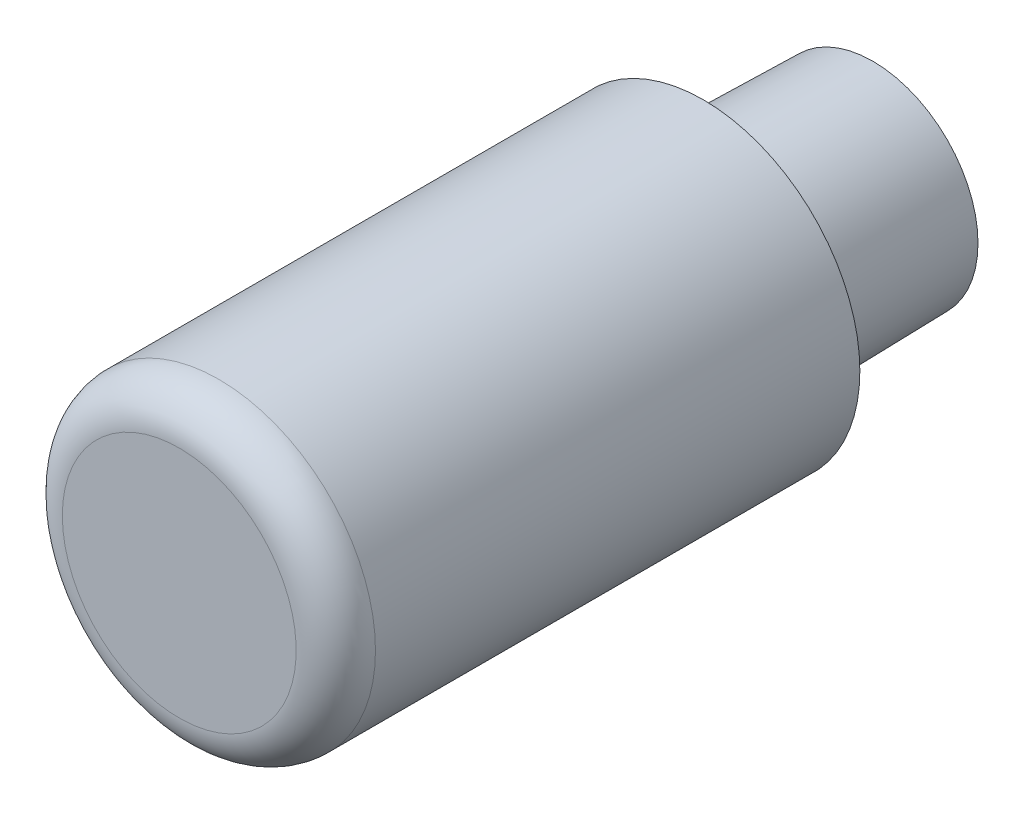
ISO-10303-21;
HEADER;
FILE_DESCRIPTION(('STEP AP214'),'2;1');
FILE_NAME('part.step','',(''),(''),'','','');
FILE_SCHEMA(('AUTOMOTIVE_DESIGN { 1 0 10303 214 1 1 1 1 }'));
ENDSEC;
DATA;
#1=APPLICATION_CONTEXT('core data for automotive mechanical design processes');
#2=APPLICATION_PROTOCOL_DEFINITION('international standard','automotive_design',2000,#1);
#3=PRODUCT_CONTEXT('',#1,'mechanical');
#4=PRODUCT('Part','Part','',(#3));
#5=PRODUCT_RELATED_PRODUCT_CATEGORY('part','',(#4));
#6=PRODUCT_DEFINITION_FORMATION('','',#4);
#7=PRODUCT_DEFINITION_CONTEXT('part definition',#1,'design');
#8=PRODUCT_DEFINITION('design','',#6,#7);
#9=PRODUCT_DEFINITION_SHAPE('','',#8);
#10=(LENGTH_UNIT() NAMED_UNIT(*) SI_UNIT(.MILLI.,.METRE.));
#11=(NAMED_UNIT(*) PLANE_ANGLE_UNIT() SI_UNIT($,.RADIAN.));
#12=(NAMED_UNIT(*) SI_UNIT($,.STERADIAN.) SOLID_ANGLE_UNIT());
#13=UNCERTAINTY_MEASURE_WITH_UNIT(LENGTH_MEASURE(1.E-05),#10,'distance_accuracy_value','');
#14=(GEOMETRIC_REPRESENTATION_CONTEXT(3) GLOBAL_UNCERTAINTY_ASSIGNED_CONTEXT((#13)) GLOBAL_UNIT_ASSIGNED_CONTEXT((#10,
#11,#12)) REPRESENTATION_CONTEXT('',''));
#15=CARTESIAN_POINT('',(0.,0.,0.));
#16=DIRECTION('',(0.,0.,1.));
#17=DIRECTION('',(1.,0.,0.));
#18=AXIS2_PLACEMENT_3D('',#15,#16,#17);
#19=CARTESIAN_POINT('',(0.,0.,38.6588));
#20=DIRECTION('',(0.,0.,-1.));
#21=DIRECTION('',(-1.,0.,0.));
#22=AXIS2_PLACEMENT_3D('',#19,#20,#21);
#23=PLANE('',#22);
#24=CARTESIAN_POINT('',(0.,0.,38.6588));
#25=DIRECTION('',(0.,0.,-1.));
#26=DIRECTION('',(-1.,0.,0.));
#27=AXIS2_PLACEMENT_3D('',#24,#25,#26);
#28=CIRCLE('',#27,7.493);
#29=CARTESIAN_POINT('',(-7.493,0.,38.6588));
#30=VERTEX_POINT('',#29);
#31=EDGE_CURVE('E42',#30,#30,#28,.F.);
#32=ORIENTED_EDGE('',*,*,#31,.T.);
#33=EDGE_LOOP('',(#32));
#34=FACE_BOUND('',#33,.T.);
#35=ADVANCED_FACE('F35',(#34),#23,.F.);
#36=CARTESIAN_POINT('',(0.,0.,26.8029829819766));
#37=DIRECTION('',(0.,0.,1.));
#38=DIRECTION('',(1.,0.,0.));
#39=AXIS2_PLACEMENT_3D('',#36,#37,#38);
#40=CYLINDRICAL_SURFACE('',#39,10.033);
#41=CARTESIAN_POINT('',(0.,0.,36.1188));
#42=DIRECTION('',(0.,0.,-1.));
#43=DIRECTION('',(-1.,0.,0.));
#44=AXIS2_PLACEMENT_3D('',#41,#42,#43);
#45=CIRCLE('',#44,10.033);
#46=CARTESIAN_POINT('',(-10.033,0.,36.1188));
#47=VERTEX_POINT('',#46);
#48=EDGE_CURVE('E10',#47,#47,#45,.T.);
#49=ORIENTED_EDGE('',*,*,#48,.T.);
#50=EDGE_LOOP('',(#49));
#51=FACE_BOUND('',#50,.T.);
#52=CARTESIAN_POINT('',(0.,0.,5.08));
#53=DIRECTION('',(0.,0.,1.));
#54=DIRECTION('',(1.,0.,0.));
#55=AXIS2_PLACEMENT_3D('',#52,#53,#54);
#56=CIRCLE('',#55,10.033);
#57=CARTESIAN_POINT('',(10.033,0.,5.08));
#58=VERTEX_POINT('',#57);
#59=EDGE_CURVE('E46',#58,#58,#56,.T.);
#60=ORIENTED_EDGE('',*,*,#59,.T.);
#61=EDGE_LOOP('',(#60));
#62=FACE_BOUND('',#61,.T.);
#63=ADVANCED_FACE('F73',(#51,#62),#40,.T.);
#64=CARTESIAN_POINT('',(0.,10.033,5.08));
#65=DIRECTION('',(0.,0.,1.));
#66=DIRECTION('',(1.,0.,0.));
#67=AXIS2_PLACEMENT_3D('',#64,#65,#66);
#68=PLANE('',#67);
#69=ORIENTED_EDGE('',*,*,#59,.F.);
#70=EDGE_LOOP('',(#69));
#71=FACE_BOUND('',#70,.T.);
#72=CARTESIAN_POINT('',(0.,0.,5.08));
#73=DIRECTION('',(0.,0.,1.));
#74=DIRECTION('',(1.,0.,0.));
#75=AXIS2_PLACEMENT_3D('',#72,#73,#74);
#76=CIRCLE('',#75,6.9596);
#77=CARTESIAN_POINT('',(6.9596,0.,5.08));
#78=VERTEX_POINT('',#77);
#79=EDGE_CURVE('E50',#78,#78,#76,.T.);
#80=ORIENTED_EDGE('',*,*,#79,.T.);
#81=EDGE_LOOP('',(#80));
#82=FACE_BOUND('',#81,.T.);
#83=ADVANCED_FACE('F69',(#71,#82),#68,.F.);
#84=CARTESIAN_POINT('',(0.,0.,-5.7912));
#85=DIRECTION('',(0.,0.,1.));
#86=DIRECTION('',(1.,0.,0.));
#87=AXIS2_PLACEMENT_3D('',#84,#85,#86);
#88=CONICAL_SURFACE('',#87,6.73188082238531,0.020943951023932);
#89=ORIENTED_EDGE('',*,*,#79,.F.);
#90=EDGE_LOOP('',(#89));
#91=FACE_BOUND('',#90,.T.);
#92=CARTESIAN_POINT('',(0.,0.,-5.7912));
#93=DIRECTION('',(0.,0.,1.));
#94=DIRECTION('',(1.,0.,0.));
#95=AXIS2_PLACEMENT_3D('',#92,#93,#94);
#96=CIRCLE('',#95,6.73188082238531);
#97=CARTESIAN_POINT('',(6.73188082238531,0.,-5.7912));
#98=VERTEX_POINT('',#97);
#99=EDGE_CURVE('E55',#98,#98,#96,.T.);
#100=ORIENTED_EDGE('',*,*,#99,.T.);
#101=EDGE_LOOP('',(#100));
#102=FACE_BOUND('',#101,.T.);
#103=ADVANCED_FACE('F59',(#91,#102),#88,.T.);
#104=CARTESIAN_POINT('',(0.,6.73188082238531,-5.7912));
#105=DIRECTION('',(0.,0.,1.));
#106=DIRECTION('',(1.,0.,0.));
#107=AXIS2_PLACEMENT_3D('',#104,#105,#106);
#108=PLANE('',#107);
#109=ORIENTED_EDGE('',*,*,#99,.F.);
#110=EDGE_LOOP('',(#109));
#111=FACE_BOUND('',#110,.T.);
#112=ADVANCED_FACE('F61',(#111),#108,.F.);
#113=CARTESIAN_POINT('',(0.,0.,36.1188));
#114=DIRECTION('',(0.,0.,-1.));
#115=DIRECTION('',(-1.,0.,0.));
#116=AXIS2_PLACEMENT_3D('',#113,#114,#115);
#117=TOROIDAL_SURFACE('',#116,7.493,2.54);
#118=ORIENTED_EDGE('',*,*,#48,.F.);
#119=EDGE_LOOP('',(#118));
#120=FACE_BOUND('',#119,.T.);
#121=ORIENTED_EDGE('',*,*,#31,.F.);
#122=EDGE_LOOP('',(#121));
#123=FACE_BOUND('',#122,.T.);
#124=ADVANCED_FACE('F37',(#120,#123),#117,.T.);
#125=CLOSED_SHELL('',(#35,#63,#83,#103,#112,#124));
#126=MANIFOLD_SOLID_BREP('B2',#125);
#127=ADVANCED_BREP_SHAPE_REPRESENTATION('',(#18,#126),#14);
#128=SHAPE_DEFINITION_REPRESENTATION(#9,#127);
ENDSEC;
END-ISO-10303-21;
